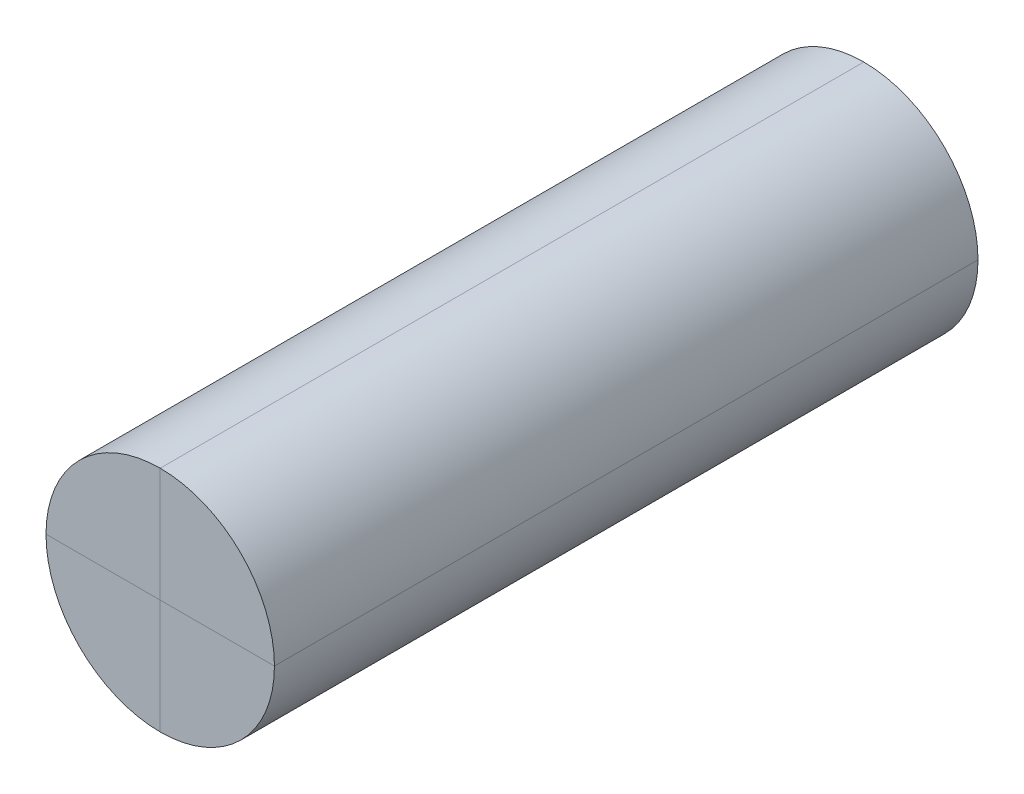
ISO-10303-21;
HEADER;
FILE_DESCRIPTION(('STEP AP214'),'2;1');
FILE_NAME('part.step','',(''),(''),'','','');
FILE_SCHEMA(('AUTOMOTIVE_DESIGN { 1 0 10303 214 1 1 1 1 }'));
ENDSEC;
DATA;
#1=APPLICATION_CONTEXT('core data for automotive mechanical design processes');
#2=APPLICATION_PROTOCOL_DEFINITION('international standard','automotive_design',2000,#1);
#3=PRODUCT_CONTEXT('',#1,'mechanical');
#4=PRODUCT('Part','Part','',(#3));
#5=PRODUCT_RELATED_PRODUCT_CATEGORY('part','',(#4));
#6=PRODUCT_DEFINITION_FORMATION('','',#4);
#7=PRODUCT_DEFINITION_CONTEXT('part definition',#1,'design');
#8=PRODUCT_DEFINITION('design','',#6,#7);
#9=PRODUCT_DEFINITION_SHAPE('','',#8);
#10=(LENGTH_UNIT() NAMED_UNIT(*) SI_UNIT(.MILLI.,.METRE.));
#11=(NAMED_UNIT(*) PLANE_ANGLE_UNIT() SI_UNIT($,.RADIAN.));
#12=(NAMED_UNIT(*) SI_UNIT($,.STERADIAN.) SOLID_ANGLE_UNIT());
#13=UNCERTAINTY_MEASURE_WITH_UNIT(LENGTH_MEASURE(1.E-05),#10,'distance_accuracy_value','');
#14=(GEOMETRIC_REPRESENTATION_CONTEXT(3) GLOBAL_UNCERTAINTY_ASSIGNED_CONTEXT((#13)) GLOBAL_UNIT_ASSIGNED_CONTEXT((#10,
#11,#12)) REPRESENTATION_CONTEXT('',''));
#15=CARTESIAN_POINT('',(0.,0.,0.));
#16=DIRECTION('',(0.,0.,1.));
#17=DIRECTION('',(1.,0.,0.));
#18=AXIS2_PLACEMENT_3D('',#15,#16,#17);
#19=CARTESIAN_POINT('',(0.,0.,0.));
#20=DIRECTION('',(0.,0.,1.));
#21=DIRECTION('',(1.,0.,0.));
#22=AXIS2_PLACEMENT_3D('',#19,#20,#21);
#23=PLANE('',#22);
#24=DIRECTION('',(-1.,0.,0.));
#25=VECTOR('',#24,1.);
#26=CARTESIAN_POINT('',(0.,0.,0.));
#27=LINE('',#26,#25);
#28=CARTESIAN_POINT('',(0.,0.,0.));
#29=VERTEX_POINT('',#28);
#30=CARTESIAN_POINT('',(-3.81,0.,0.));
#31=VERTEX_POINT('',#30);
#32=EDGE_CURVE('E11',#29,#31,#27,.T.);
#33=ORIENTED_EDGE('',*,*,#32,.F.);
#34=DIRECTION('',(0.,1.,0.));
#35=VECTOR('',#34,1.);
#36=CARTESIAN_POINT('',(0.,0.,0.));
#37=LINE('',#36,#35);
#38=CARTESIAN_POINT('',(0.,-3.81,0.));
#39=VERTEX_POINT('',#38);
#40=EDGE_CURVE('E140',#39,#29,#37,.T.);
#41=ORIENTED_EDGE('',*,*,#40,.F.);
#42=CARTESIAN_POINT('',(0.,0.,0.));
#43=DIRECTION('',(0.,0.,1.));
#44=DIRECTION('',(1.,0.,0.));
#45=AXIS2_PLACEMENT_3D('',#42,#43,#44);
#46=CIRCLE('',#45,3.81);
#47=EDGE_CURVE('E174',#31,#39,#46,.T.);
#48=ORIENTED_EDGE('',*,*,#47,.F.);
#49=EDGE_LOOP('',(#33,#41,#48));
#50=FACE_BOUND('',#49,.T.);
#51=ADVANCED_FACE('F40',(#50),#23,.F.);
#52=DIRECTION('',(-1.,0.,0.));
#53=VECTOR('',#52,1.);
#54=CARTESIAN_POINT('',(0.,0.,0.));
#55=LINE('',#54,#53);
#56=CARTESIAN_POINT('',(3.81,0.,0.));
#57=VERTEX_POINT('',#56);
#58=EDGE_CURVE('E50',#57,#29,#55,.T.);
#59=ORIENTED_EDGE('',*,*,#58,.F.);
#60=EDGE_CURVE('E138',#39,#57,#46,.T.);
#61=ORIENTED_EDGE('',*,*,#60,.F.);
#62=ORIENTED_EDGE('',*,*,#40,.T.);
#63=EDGE_LOOP('',(#59,#61,#62));
#64=FACE_BOUND('',#63,.T.);
#65=ADVANCED_FACE('F176',(#64),#23,.F.);
#66=CARTESIAN_POINT('',(0.,0.,23.47));
#67=DIRECTION('',(0.,0.,1.));
#68=DIRECTION('',(1.,0.,0.));
#69=AXIS2_PLACEMENT_3D('',#66,#67,#68);
#70=PLANE('',#69);
#71=DIRECTION('',(0.,1.,0.));
#72=VECTOR('',#71,1.);
#73=CARTESIAN_POINT('',(0.,0.,23.47));
#74=LINE('',#73,#72);
#75=CARTESIAN_POINT('',(0.,-3.81,23.47));
#76=VERTEX_POINT('',#75);
#77=CARTESIAN_POINT('',(0.,0.,23.47));
#78=VERTEX_POINT('',#77);
#79=EDGE_CURVE('E95',#76,#78,#74,.T.);
#80=ORIENTED_EDGE('',*,*,#79,.T.);
#81=DIRECTION('',(-1.,0.,0.));
#82=VECTOR('',#81,1.);
#83=CARTESIAN_POINT('',(0.,0.,23.47));
#84=LINE('',#83,#82);
#85=CARTESIAN_POINT('',(-3.81,0.,23.47));
#86=VERTEX_POINT('',#85);
#87=EDGE_CURVE('E64',#78,#86,#84,.T.);
#88=ORIENTED_EDGE('',*,*,#87,.T.);
#89=CARTESIAN_POINT('',(0.,0.,23.47));
#90=DIRECTION('',(0.,0.,1.));
#91=DIRECTION('',(1.,0.,0.));
#92=AXIS2_PLACEMENT_3D('',#89,#90,#91);
#93=CIRCLE('',#92,3.81);
#94=EDGE_CURVE('E109',#86,#76,#93,.T.);
#95=ORIENTED_EDGE('',*,*,#94,.T.);
#96=EDGE_LOOP('',(#80,#88,#95));
#97=FACE_BOUND('',#96,.T.);
#98=ADVANCED_FACE('F171',(#97),#70,.T.);
#99=CARTESIAN_POINT('',(3.81,0.,23.47));
#100=VERTEX_POINT('',#99);
#101=EDGE_CURVE('E106',#76,#100,#93,.T.);
#102=ORIENTED_EDGE('',*,*,#101,.T.);
#103=DIRECTION('',(-1.,0.,0.));
#104=VECTOR('',#103,1.);
#105=CARTESIAN_POINT('',(0.,0.,23.47));
#106=LINE('',#105,#104);
#107=EDGE_CURVE('E101',#100,#78,#106,.T.);
#108=ORIENTED_EDGE('',*,*,#107,.T.);
#109=ORIENTED_EDGE('',*,*,#79,.F.);
#110=EDGE_LOOP('',(#102,#108,#109));
#111=FACE_BOUND('',#110,.T.);
#112=ADVANCED_FACE('F131',(#111),#70,.T.);
#113=CARTESIAN_POINT('',(0.,0.,23.47));
#114=DIRECTION('',(0.,0.,-1.));
#115=DIRECTION('',(-1.,0.,0.));
#116=AXIS2_PLACEMENT_3D('',#113,#114,#115);
#117=CYLINDRICAL_SURFACE('',#116,3.81);
#118=DIRECTION('',(0.,0.,-1.));
#119=VECTOR('',#118,1.);
#120=CARTESIAN_POINT('',(-3.81,0.,23.47));
#121=LINE('',#120,#119);
#122=EDGE_CURVE('E124',#31,#86,#121,.F.);
#123=ORIENTED_EDGE('',*,*,#122,.F.);
#124=ORIENTED_EDGE('',*,*,#47,.T.);
#125=DIRECTION('',(0.,0.,-1.));
#126=VECTOR('',#125,1.);
#127=CARTESIAN_POINT('',(0.,-3.81,23.47));
#128=LINE('',#127,#126);
#129=EDGE_CURVE('E119',#76,#39,#128,.T.);
#130=ORIENTED_EDGE('',*,*,#129,.F.);
#131=ORIENTED_EDGE('',*,*,#94,.F.);
#132=EDGE_LOOP('',(#123,#124,#130,#131));
#133=FACE_BOUND('',#132,.T.);
#134=ADVANCED_FACE('F173',(#133),#117,.T.);
#135=DIRECTION('',(0.,0.,-1.));
#136=VECTOR('',#135,1.);
#137=CARTESIAN_POINT('',(3.81,0.,23.47));
#138=LINE('',#137,#136);
#139=EDGE_CURVE('E44',#100,#57,#138,.T.);
#140=ORIENTED_EDGE('',*,*,#139,.F.);
#141=ORIENTED_EDGE('',*,*,#101,.F.);
#142=ORIENTED_EDGE('',*,*,#129,.T.);
#143=ORIENTED_EDGE('',*,*,#60,.T.);
#144=EDGE_LOOP('',(#140,#141,#142,#143));
#145=FACE_BOUND('',#144,.T.);
#146=ADVANCED_FACE('F134',(#145),#117,.T.);
#147=CARTESIAN_POINT('',(0.,3.81,0.));
#148=VERTEX_POINT('',#147);
#149=EDGE_CURVE('E148',#29,#148,#37,.T.);
#150=ORIENTED_EDGE('',*,*,#149,.F.);
#151=ORIENTED_EDGE('',*,*,#32,.T.);
#152=EDGE_CURVE('E107',#148,#31,#46,.T.);
#153=ORIENTED_EDGE('',*,*,#152,.F.);
#154=EDGE_LOOP('',(#150,#151,#153));
#155=FACE_BOUND('',#154,.T.);
#156=ADVANCED_FACE('F182',(#155),#23,.F.);
#157=ORIENTED_EDGE('',*,*,#152,.T.);
#158=ORIENTED_EDGE('',*,*,#122,.T.);
#159=CARTESIAN_POINT('',(0.,3.81,23.47));
#160=VERTEX_POINT('',#159);
#161=EDGE_CURVE('E91',#160,#86,#93,.T.);
#162=ORIENTED_EDGE('',*,*,#161,.F.);
#163=DIRECTION('',(0.,0.,-1.));
#164=VECTOR('',#163,1.);
#165=CARTESIAN_POINT('',(0.,3.81,23.47));
#166=LINE('',#165,#164);
#167=EDGE_CURVE('E112',#148,#160,#166,.F.);
#168=ORIENTED_EDGE('',*,*,#167,.F.);
#169=EDGE_LOOP('',(#157,#158,#162,#168));
#170=FACE_BOUND('',#169,.T.);
#171=ADVANCED_FACE('F122',(#170),#117,.T.);
#172=ORIENTED_EDGE('',*,*,#87,.F.);
#173=EDGE_CURVE('E87',#78,#160,#74,.T.);
#174=ORIENTED_EDGE('',*,*,#173,.T.);
#175=ORIENTED_EDGE('',*,*,#161,.T.);
#176=EDGE_LOOP('',(#172,#174,#175));
#177=FACE_BOUND('',#176,.T.);
#178=ADVANCED_FACE('F89',(#177),#70,.T.);
#179=EDGE_CURVE('E98',#100,#160,#93,.T.);
#180=ORIENTED_EDGE('',*,*,#179,.F.);
#181=ORIENTED_EDGE('',*,*,#139,.T.);
#182=EDGE_CURVE('E114',#57,#148,#46,.T.);
#183=ORIENTED_EDGE('',*,*,#182,.T.);
#184=ORIENTED_EDGE('',*,*,#167,.T.);
#185=EDGE_LOOP('',(#180,#181,#183,#184));
#186=FACE_BOUND('',#185,.T.);
#187=ADVANCED_FACE('F42',(#186),#117,.T.);
#188=ORIENTED_EDGE('',*,*,#107,.F.);
#189=ORIENTED_EDGE('',*,*,#179,.T.);
#190=ORIENTED_EDGE('',*,*,#173,.F.);
#191=EDGE_LOOP('',(#188,#189,#190));
#192=FACE_BOUND('',#191,.T.);
#193=ADVANCED_FACE('F100',(#192),#70,.T.);
#194=ORIENTED_EDGE('',*,*,#182,.F.);
#195=ORIENTED_EDGE('',*,*,#58,.T.);
#196=ORIENTED_EDGE('',*,*,#149,.T.);
#197=EDGE_LOOP('',(#194,#195,#196));
#198=FACE_BOUND('',#197,.T.);
#199=ADVANCED_FACE('F178',(#198),#23,.F.);
#200=CLOSED_SHELL('',(#51,#65,#98,#112,#134,#146,#156,#171,#178,#187,#193,#199));
#201=MANIFOLD_SOLID_BREP('B2',#200);
#202=ADVANCED_BREP_SHAPE_REPRESENTATION('',(#18,#201),#14);
#203=SHAPE_DEFINITION_REPRESENTATION(#9,#202);
ENDSEC;
END-ISO-10303-21;
